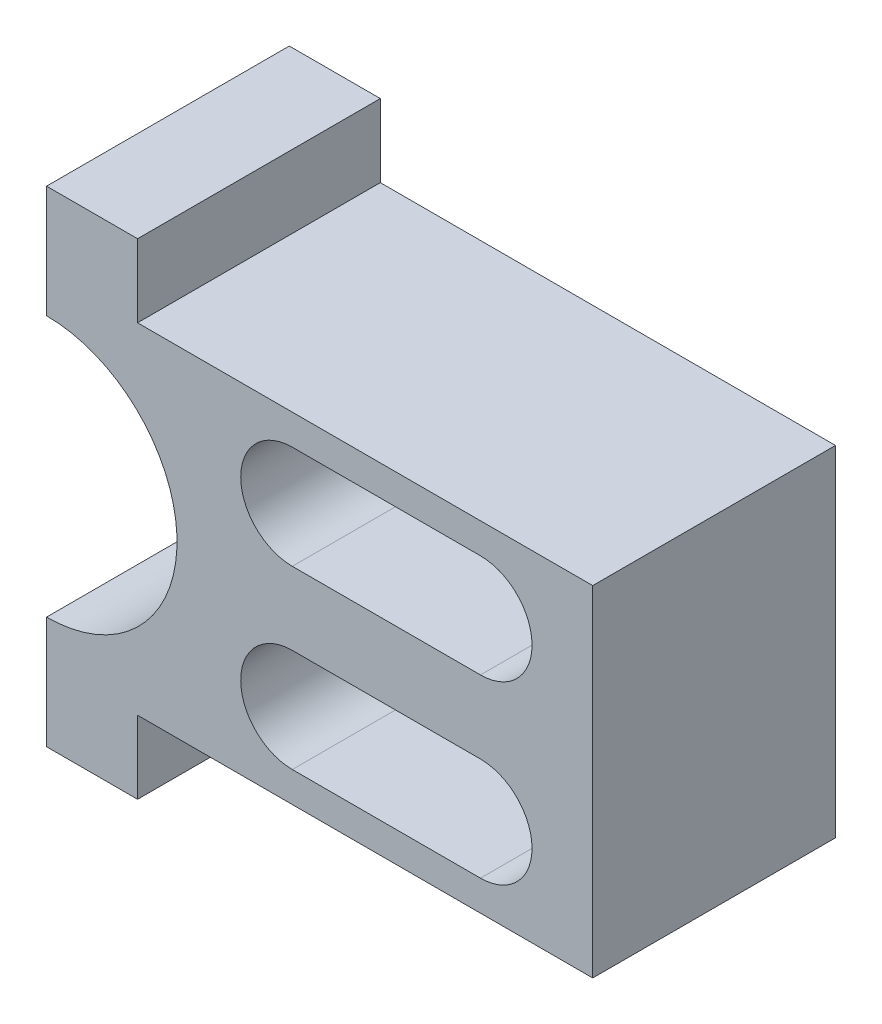
ISO-10303-21;
HEADER;
FILE_DESCRIPTION(('STEP AP214'),'2;1');
FILE_NAME('part.step','',(''),(''),'','','');
FILE_SCHEMA(('AUTOMOTIVE_DESIGN { 1 0 10303 214 1 1 1 1 }'));
ENDSEC;
DATA;
#1=APPLICATION_CONTEXT('core data for automotive mechanical design processes');
#2=APPLICATION_PROTOCOL_DEFINITION('international standard','automotive_design',2000,#1);
#3=PRODUCT_CONTEXT('',#1,'mechanical');
#4=PRODUCT('Part','Part','',(#3));
#5=PRODUCT_RELATED_PRODUCT_CATEGORY('part','',(#4));
#6=PRODUCT_DEFINITION_FORMATION('','',#4);
#7=PRODUCT_DEFINITION_CONTEXT('part definition',#1,'design');
#8=PRODUCT_DEFINITION('design','',#6,#7);
#9=PRODUCT_DEFINITION_SHAPE('','',#8);
#10=(LENGTH_UNIT() NAMED_UNIT(*) SI_UNIT(.MILLI.,.METRE.));
#11=(NAMED_UNIT(*) PLANE_ANGLE_UNIT() SI_UNIT($,.RADIAN.));
#12=(NAMED_UNIT(*) SI_UNIT($,.STERADIAN.) SOLID_ANGLE_UNIT());
#13=UNCERTAINTY_MEASURE_WITH_UNIT(LENGTH_MEASURE(1.E-05),#10,'distance_accuracy_value','');
#14=(GEOMETRIC_REPRESENTATION_CONTEXT(3) GLOBAL_UNCERTAINTY_ASSIGNED_CONTEXT((#13)) GLOBAL_UNIT_ASSIGNED_CONTEXT((#10,
#11,#12)) REPRESENTATION_CONTEXT('',''));
#15=CARTESIAN_POINT('',(0.,0.,0.));
#16=DIRECTION('',(0.,0.,1.));
#17=DIRECTION('',(1.,0.,0.));
#18=AXIS2_PLACEMENT_3D('',#15,#16,#17);
#19=CARTESIAN_POINT('',(0.,-40.,40.));
#20=DIRECTION('',(0.,-1.,0.));
#21=DIRECTION('',(1.,0.,0.));
#22=AXIS2_PLACEMENT_3D('',#19,#20,#21);
#23=PLANE('',#22);
#24=DIRECTION('',(-1.,0.,0.));
#25=VECTOR('',#24,1.);
#26=CARTESIAN_POINT('',(0.,-40.,0.));
#27=LINE('',#26,#25);
#28=CARTESIAN_POINT('',(-30.,-40.,0.));
#29=VERTEX_POINT('',#28);
#30=CARTESIAN_POINT('',(-45.,-40.,0.));
#31=VERTEX_POINT('',#30);
#32=EDGE_CURVE('E191',#29,#31,#27,.T.);
#33=ORIENTED_EDGE('',*,*,#32,.F.);
#34=DIRECTION('',(0.,0.,1.));
#35=VECTOR('',#34,1.);
#36=CARTESIAN_POINT('',(-30.,-40.,0.));
#37=LINE('',#36,#35);
#38=CARTESIAN_POINT('',(-30.,-40.,40.));
#39=VERTEX_POINT('',#38);
#40=EDGE_CURVE('E397',#29,#39,#37,.T.);
#41=ORIENTED_EDGE('',*,*,#40,.T.);
#42=DIRECTION('',(-1.,0.,0.));
#43=VECTOR('',#42,1.);
#44=CARTESIAN_POINT('',(0.,-40.,40.));
#45=LINE('',#44,#43);
#46=CARTESIAN_POINT('',(-45.,-40.,40.));
#47=VERTEX_POINT('',#46);
#48=EDGE_CURVE('E289',#39,#47,#45,.T.);
#49=ORIENTED_EDGE('',*,*,#48,.T.);
#50=DIRECTION('',(0.,0.,-1.));
#51=VECTOR('',#50,1.);
#52=CARTESIAN_POINT('',(-45.,-40.,40.));
#53=LINE('',#52,#51);
#54=EDGE_CURVE('E223',#47,#31,#53,.T.);
#55=ORIENTED_EDGE('',*,*,#54,.T.);
#56=EDGE_LOOP('',(#33,#41,#49,#55));
#57=FACE_BOUND('',#56,.T.);
#58=ADVANCED_FACE('F43',(#57),#23,.T.);
#59=CARTESIAN_POINT('',(45.,0.,40.));
#60=DIRECTION('',(1.,0.,0.));
#61=DIRECTION('',(0.,1.,0.));
#62=AXIS2_PLACEMENT_3D('',#59,#60,#61);
#63=PLANE('',#62);
#64=DIRECTION('',(0.,-1.,0.));
#65=VECTOR('',#64,1.);
#66=CARTESIAN_POINT('',(45.,0.,40.));
#67=LINE('',#66,#65);
#68=CARTESIAN_POINT('',(45.,28.,40.));
#69=VERTEX_POINT('',#68);
#70=CARTESIAN_POINT('',(45.,-28.,40.));
#71=VERTEX_POINT('',#70);
#72=EDGE_CURVE('E186',#69,#71,#67,.T.);
#73=ORIENTED_EDGE('',*,*,#72,.T.);
#74=DIRECTION('',(0.,0.,1.));
#75=VECTOR('',#74,1.);
#76=CARTESIAN_POINT('',(45.,-28.,0.));
#77=LINE('',#76,#75);
#78=CARTESIAN_POINT('',(45.,-28.,0.));
#79=VERTEX_POINT('',#78);
#80=EDGE_CURVE('E171',#79,#71,#77,.T.);
#81=ORIENTED_EDGE('',*,*,#80,.F.);
#82=DIRECTION('',(0.,-1.,0.));
#83=VECTOR('',#82,1.);
#84=CARTESIAN_POINT('',(45.,0.,0.));
#85=LINE('',#84,#83);
#86=CARTESIAN_POINT('',(45.,28.,0.));
#87=VERTEX_POINT('',#86);
#88=EDGE_CURVE('E184',#87,#79,#85,.T.);
#89=ORIENTED_EDGE('',*,*,#88,.F.);
#90=DIRECTION('',(0.,0.,1.));
#91=VECTOR('',#90,1.);
#92=CARTESIAN_POINT('',(45.,28.,0.));
#93=LINE('',#92,#91);
#94=EDGE_CURVE('E254',#87,#69,#93,.T.);
#95=ORIENTED_EDGE('',*,*,#94,.T.);
#96=EDGE_LOOP('',(#73,#81,#89,#95));
#97=FACE_BOUND('',#96,.T.);
#98=ADVANCED_FACE('F182',(#97),#63,.T.);
#99=CARTESIAN_POINT('',(0.,0.,40.));
#100=DIRECTION('',(0.,0.,1.));
#101=DIRECTION('',(1.,0.,0.));
#102=AXIS2_PLACEMENT_3D('',#99,#100,#101);
#103=PLANE('',#102);
#104=CARTESIAN_POINT('',(26.5,-14.5,40.));
#105=DIRECTION('',(0.,0.,1.));
#106=DIRECTION('',(1.,0.,0.));
#107=AXIS2_PLACEMENT_3D('',#104,#105,#106);
#108=CIRCLE('',#107,8.5);
#109=CARTESIAN_POINT('',(26.5,-23.,40.));
#110=VERTEX_POINT('',#109);
#111=CARTESIAN_POINT('',(26.5,-6.,40.));
#112=VERTEX_POINT('',#111);
#113=EDGE_CURVE('E210',#110,#112,#108,.T.);
#114=ORIENTED_EDGE('',*,*,#113,.F.);
#115=DIRECTION('',(1.,0.,0.));
#116=VECTOR('',#115,1.);
#117=CARTESIAN_POINT('',(0.,-23.,40.));
#118=LINE('',#117,#116);
#119=CARTESIAN_POINT('',(-4.5,-23.,40.));
#120=VERTEX_POINT('',#119);
#121=EDGE_CURVE('E244',#120,#110,#118,.T.);
#122=ORIENTED_EDGE('',*,*,#121,.F.);
#123=CARTESIAN_POINT('',(-4.5,-14.5,40.));
#124=DIRECTION('',(0.,0.,1.));
#125=DIRECTION('',(1.,0.,0.));
#126=AXIS2_PLACEMENT_3D('',#123,#124,#125);
#127=CIRCLE('',#126,8.5);
#128=CARTESIAN_POINT('',(-4.5,-6.,40.));
#129=VERTEX_POINT('',#128);
#130=EDGE_CURVE('E292',#129,#120,#127,.T.);
#131=ORIENTED_EDGE('',*,*,#130,.F.);
#132=DIRECTION('',(1.,0.,0.));
#133=VECTOR('',#132,1.);
#134=CARTESIAN_POINT('',(0.,-6.,40.));
#135=LINE('',#134,#133);
#136=EDGE_CURVE('E287',#129,#112,#135,.T.);
#137=ORIENTED_EDGE('',*,*,#136,.T.);
#138=EDGE_LOOP('',(#114,#122,#131,#137));
#139=FACE_BOUND('',#138,.T.);
#140=DIRECTION('',(1.,0.,0.));
#141=VECTOR('',#140,1.);
#142=CARTESIAN_POINT('',(0.,23.,40.));
#143=LINE('',#142,#141);
#144=CARTESIAN_POINT('',(-4.5,23.,40.));
#145=VERTEX_POINT('',#144);
#146=CARTESIAN_POINT('',(26.5,23.,40.));
#147=VERTEX_POINT('',#146);
#148=EDGE_CURVE('E300',#145,#147,#143,.T.);
#149=ORIENTED_EDGE('',*,*,#148,.T.);
#150=CARTESIAN_POINT('',(26.5,14.5,40.));
#151=DIRECTION('',(0.,0.,1.));
#152=DIRECTION('',(1.,0.,0.));
#153=AXIS2_PLACEMENT_3D('',#150,#151,#152);
#154=CIRCLE('',#153,8.5);
#155=CARTESIAN_POINT('',(26.5,6.,40.));
#156=VERTEX_POINT('',#155);
#157=EDGE_CURVE('E303',#147,#156,#154,.F.);
#158=ORIENTED_EDGE('',*,*,#157,.T.);
#159=DIRECTION('',(1.,0.,0.));
#160=VECTOR('',#159,1.);
#161=CARTESIAN_POINT('',(0.,6.,40.));
#162=LINE('',#161,#160);
#163=CARTESIAN_POINT('',(-4.5,6.,40.));
#164=VERTEX_POINT('',#163);
#165=EDGE_CURVE('E305',#164,#156,#162,.T.);
#166=ORIENTED_EDGE('',*,*,#165,.F.);
#167=CARTESIAN_POINT('',(-4.5,14.5,40.));
#168=DIRECTION('',(0.,0.,1.));
#169=DIRECTION('',(1.,0.,0.));
#170=AXIS2_PLACEMENT_3D('',#167,#168,#169);
#171=CIRCLE('',#170,8.5);
#172=EDGE_CURVE('E230',#164,#145,#171,.F.);
#173=ORIENTED_EDGE('',*,*,#172,.T.);
#174=EDGE_LOOP('',(#149,#158,#166,#173));
#175=FACE_BOUND('',#174,.T.);
#176=ORIENTED_EDGE('',*,*,#48,.F.);
#177=DIRECTION('',(0.,1.,0.));
#178=VECTOR('',#177,1.);
#179=CARTESIAN_POINT('',(-30.,-40.,40.));
#180=LINE('',#179,#178);
#181=CARTESIAN_POINT('',(-30.,-28.,40.));
#182=VERTEX_POINT('',#181);
#183=EDGE_CURVE('E177',#39,#182,#180,.T.);
#184=ORIENTED_EDGE('',*,*,#183,.T.);
#185=DIRECTION('',(1.,0.,0.));
#186=VECTOR('',#185,1.);
#187=CARTESIAN_POINT('',(45.,-28.,40.));
#188=LINE('',#187,#186);
#189=EDGE_CURVE('E399',#182,#71,#188,.T.);
#190=ORIENTED_EDGE('',*,*,#189,.T.);
#191=ORIENTED_EDGE('',*,*,#72,.F.);
#192=DIRECTION('',(1.,0.,0.));
#193=VECTOR('',#192,1.);
#194=CARTESIAN_POINT('',(45.,28.,40.));
#195=LINE('',#194,#193);
#196=CARTESIAN_POINT('',(-30.,28.,40.));
#197=VERTEX_POINT('',#196);
#198=EDGE_CURVE('E404',#197,#69,#195,.T.);
#199=ORIENTED_EDGE('',*,*,#198,.F.);
#200=DIRECTION('',(0.,-1.,0.));
#201=VECTOR('',#200,1.);
#202=CARTESIAN_POINT('',(-30.,40.,40.));
#203=LINE('',#202,#201);
#204=CARTESIAN_POINT('',(-30.,40.,40.));
#205=VERTEX_POINT('',#204);
#206=EDGE_CURVE('E401',#205,#197,#203,.T.);
#207=ORIENTED_EDGE('',*,*,#206,.F.);
#208=DIRECTION('',(-1.,0.,0.));
#209=VECTOR('',#208,1.);
#210=CARTESIAN_POINT('',(0.,40.,40.));
#211=LINE('',#210,#209);
#212=CARTESIAN_POINT('',(-45.,40.,40.));
#213=VERTEX_POINT('',#212);
#214=EDGE_CURVE('E298',#205,#213,#211,.T.);
#215=ORIENTED_EDGE('',*,*,#214,.T.);
#216=DIRECTION('',(0.,-1.,0.));
#217=VECTOR('',#216,1.);
#218=CARTESIAN_POINT('',(-45.,0.,40.));
#219=LINE('',#218,#217);
#220=CARTESIAN_POINT('',(-45.,21.5,40.));
#221=VERTEX_POINT('',#220);
#222=EDGE_CURVE('E291',#213,#221,#219,.T.);
#223=ORIENTED_EDGE('',*,*,#222,.T.);
#224=CARTESIAN_POINT('',(-45.,0.,40.));
#225=DIRECTION('',(0.,0.,1.));
#226=DIRECTION('',(1.,0.,0.));
#227=AXIS2_PLACEMENT_3D('',#224,#225,#226);
#228=CIRCLE('',#227,21.5);
#229=CARTESIAN_POINT('',(-45.,-21.5,40.));
#230=VERTEX_POINT('',#229);
#231=EDGE_CURVE('E283',#230,#221,#228,.T.);
#232=ORIENTED_EDGE('',*,*,#231,.F.);
#233=EDGE_CURVE('E286',#230,#47,#219,.T.);
#234=ORIENTED_EDGE('',*,*,#233,.T.);
#235=EDGE_LOOP('',(#176,#184,#190,#191,#199,#207,#215,#223,#232,#234));
#236=FACE_BOUND('',#235,.T.);
#237=ADVANCED_FACE('F311',(#139,#175,#236),#103,.T.);
#238=CARTESIAN_POINT('',(0.,0.,0.));
#239=DIRECTION('',(0.,0.,1.));
#240=DIRECTION('',(1.,0.,0.));
#241=AXIS2_PLACEMENT_3D('',#238,#239,#240);
#242=PLANE('',#241);
#243=DIRECTION('',(1.,0.,0.));
#244=VECTOR('',#243,1.);
#245=CARTESIAN_POINT('',(0.,23.,0.));
#246=LINE('',#245,#244);
#247=CARTESIAN_POINT('',(-4.5,23.,0.));
#248=VERTEX_POINT('',#247);
#249=CARTESIAN_POINT('',(26.5,23.,0.));
#250=VERTEX_POINT('',#249);
#251=EDGE_CURVE('E199',#248,#250,#246,.T.);
#252=ORIENTED_EDGE('',*,*,#251,.F.);
#253=CARTESIAN_POINT('',(-4.5,14.5,0.));
#254=DIRECTION('',(0.,0.,1.));
#255=DIRECTION('',(1.,0.,0.));
#256=AXIS2_PLACEMENT_3D('',#253,#254,#255);
#257=CIRCLE('',#256,8.5);
#258=CARTESIAN_POINT('',(-4.5,6.,0.));
#259=VERTEX_POINT('',#258);
#260=EDGE_CURVE('E208',#259,#248,#257,.F.);
#261=ORIENTED_EDGE('',*,*,#260,.F.);
#262=DIRECTION('',(1.,0.,0.));
#263=VECTOR('',#262,1.);
#264=CARTESIAN_POINT('',(0.,6.,0.));
#265=LINE('',#264,#263);
#266=CARTESIAN_POINT('',(26.5,6.,0.));
#267=VERTEX_POINT('',#266);
#268=EDGE_CURVE('E205',#259,#267,#265,.T.);
#269=ORIENTED_EDGE('',*,*,#268,.T.);
#270=CARTESIAN_POINT('',(26.5,14.5,0.));
#271=DIRECTION('',(0.,0.,1.));
#272=DIRECTION('',(1.,0.,0.));
#273=AXIS2_PLACEMENT_3D('',#270,#271,#272);
#274=CIRCLE('',#273,8.5);
#275=EDGE_CURVE('E202',#250,#267,#274,.F.);
#276=ORIENTED_EDGE('',*,*,#275,.F.);
#277=EDGE_LOOP('',(#252,#261,#269,#276));
#278=FACE_BOUND('',#277,.T.);
#279=CARTESIAN_POINT('',(26.5,-14.5,0.));
#280=DIRECTION('',(0.,0.,1.));
#281=DIRECTION('',(1.,0.,0.));
#282=AXIS2_PLACEMENT_3D('',#279,#280,#281);
#283=CIRCLE('',#282,8.5);
#284=CARTESIAN_POINT('',(26.5,-23.,0.));
#285=VERTEX_POINT('',#284);
#286=CARTESIAN_POINT('',(26.5,-6.,0.));
#287=VERTEX_POINT('',#286);
#288=EDGE_CURVE('E249',#285,#287,#283,.T.);
#289=ORIENTED_EDGE('',*,*,#288,.T.);
#290=DIRECTION('',(1.,0.,0.));
#291=VECTOR('',#290,1.);
#292=CARTESIAN_POINT('',(0.,-6.,0.));
#293=LINE('',#292,#291);
#294=CARTESIAN_POINT('',(-4.5,-6.,0.));
#295=VERTEX_POINT('',#294);
#296=EDGE_CURVE('E258',#295,#287,#293,.T.);
#297=ORIENTED_EDGE('',*,*,#296,.F.);
#298=CARTESIAN_POINT('',(-4.5,-14.5,0.));
#299=DIRECTION('',(0.,0.,1.));
#300=DIRECTION('',(1.,0.,0.));
#301=AXIS2_PLACEMENT_3D('',#298,#299,#300);
#302=CIRCLE('',#301,8.5);
#303=CARTESIAN_POINT('',(-4.5,-23.,0.));
#304=VERTEX_POINT('',#303);
#305=EDGE_CURVE('E256',#295,#304,#302,.T.);
#306=ORIENTED_EDGE('',*,*,#305,.T.);
#307=DIRECTION('',(1.,0.,0.));
#308=VECTOR('',#307,1.);
#309=CARTESIAN_POINT('',(0.,-23.,0.));
#310=LINE('',#309,#308);
#311=EDGE_CURVE('E241',#304,#285,#310,.T.);
#312=ORIENTED_EDGE('',*,*,#311,.T.);
#313=EDGE_LOOP('',(#289,#297,#306,#312));
#314=FACE_BOUND('',#313,.T.);
#315=DIRECTION('',(0.,1.,0.));
#316=VECTOR('',#315,1.);
#317=CARTESIAN_POINT('',(-30.,-40.,0.));
#318=LINE('',#317,#316);
#319=CARTESIAN_POINT('',(-30.,-28.,0.));
#320=VERTEX_POINT('',#319);
#321=EDGE_CURVE('E176',#29,#320,#318,.T.);
#322=ORIENTED_EDGE('',*,*,#321,.F.);
#323=ORIENTED_EDGE('',*,*,#32,.T.);
#324=DIRECTION('',(0.,-1.,0.));
#325=VECTOR('',#324,1.);
#326=CARTESIAN_POINT('',(-45.,0.,0.));
#327=LINE('',#326,#325);
#328=CARTESIAN_POINT('',(-45.,-21.5,0.));
#329=VERTEX_POINT('',#328);
#330=EDGE_CURVE('E195',#329,#31,#327,.T.);
#331=ORIENTED_EDGE('',*,*,#330,.F.);
#332=CARTESIAN_POINT('',(-45.,0.,0.));
#333=DIRECTION('',(0.,0.,1.));
#334=DIRECTION('',(1.,0.,0.));
#335=AXIS2_PLACEMENT_3D('',#332,#333,#334);
#336=CIRCLE('',#335,21.5);
#337=CARTESIAN_POINT('',(-45.,21.5,0.));
#338=VERTEX_POINT('',#337);
#339=EDGE_CURVE('E263',#329,#338,#336,.T.);
#340=ORIENTED_EDGE('',*,*,#339,.T.);
#341=CARTESIAN_POINT('',(-45.,40.,0.));
#342=VERTEX_POINT('',#341);
#343=EDGE_CURVE('E193',#342,#338,#327,.T.);
#344=ORIENTED_EDGE('',*,*,#343,.F.);
#345=DIRECTION('',(-1.,0.,0.));
#346=VECTOR('',#345,1.);
#347=CARTESIAN_POINT('',(0.,40.,0.));
#348=LINE('',#347,#346);
#349=CARTESIAN_POINT('',(-30.,40.,0.));
#350=VERTEX_POINT('',#349);
#351=EDGE_CURVE('E190',#350,#342,#348,.T.);
#352=ORIENTED_EDGE('',*,*,#351,.F.);
#353=DIRECTION('',(0.,-1.,0.));
#354=VECTOR('',#353,1.);
#355=CARTESIAN_POINT('',(-30.,40.,0.));
#356=LINE('',#355,#354);
#357=CARTESIAN_POINT('',(-30.,28.,0.));
#358=VERTEX_POINT('',#357);
#359=EDGE_CURVE('E409',#350,#358,#356,.T.);
#360=ORIENTED_EDGE('',*,*,#359,.T.);
#361=DIRECTION('',(1.,0.,0.));
#362=VECTOR('',#361,1.);
#363=CARTESIAN_POINT('',(45.,28.,0.));
#364=LINE('',#363,#362);
#365=EDGE_CURVE('E68',#358,#87,#364,.T.);
#366=ORIENTED_EDGE('',*,*,#365,.T.);
#367=ORIENTED_EDGE('',*,*,#88,.T.);
#368=DIRECTION('',(1.,0.,0.));
#369=VECTOR('',#368,1.);
#370=CARTESIAN_POINT('',(45.,-28.,0.));
#371=LINE('',#370,#369);
#372=EDGE_CURVE('E168',#320,#79,#371,.T.);
#373=ORIENTED_EDGE('',*,*,#372,.F.);
#374=EDGE_LOOP('',(#322,#323,#331,#340,#344,#352,#360,#366,#367,#373));
#375=FACE_BOUND('',#374,.T.);
#376=ADVANCED_FACE('F188',(#278,#314,#375),#242,.F.);
#377=CARTESIAN_POINT('',(0.,23.,40.));
#378=DIRECTION('',(0.,1.,0.));
#379=DIRECTION('',(0.,0.,1.));
#380=AXIS2_PLACEMENT_3D('',#377,#378,#379);
#381=PLANE('',#380);
#382=ORIENTED_EDGE('',*,*,#251,.T.);
#383=DIRECTION('',(0.,0.,-1.));
#384=VECTOR('',#383,1.);
#385=CARTESIAN_POINT('',(26.5,23.,40.));
#386=LINE('',#385,#384);
#387=EDGE_CURVE('E11',#147,#250,#386,.T.);
#388=ORIENTED_EDGE('',*,*,#387,.F.);
#389=ORIENTED_EDGE('',*,*,#148,.F.);
#390=DIRECTION('',(0.,0.,-1.));
#391=VECTOR('',#390,1.);
#392=CARTESIAN_POINT('',(-4.5,23.,40.));
#393=LINE('',#392,#391);
#394=EDGE_CURVE('E211',#145,#248,#393,.T.);
#395=ORIENTED_EDGE('',*,*,#394,.T.);
#396=EDGE_LOOP('',(#382,#388,#389,#395));
#397=FACE_BOUND('',#396,.T.);
#398=ADVANCED_FACE('F319',(#397),#381,.F.);
#399=CARTESIAN_POINT('',(26.5,14.5,40.));
#400=DIRECTION('',(0.,0.,-1.));
#401=DIRECTION('',(-1.,0.,0.));
#402=AXIS2_PLACEMENT_3D('',#399,#400,#401);
#403=CYLINDRICAL_SURFACE('',#402,8.5);
#404=ORIENTED_EDGE('',*,*,#275,.T.);
#405=DIRECTION('',(0.,0.,-1.));
#406=VECTOR('',#405,1.);
#407=CARTESIAN_POINT('',(26.5,6.,40.));
#408=LINE('',#407,#406);
#409=EDGE_CURVE('E52',#156,#267,#408,.T.);
#410=ORIENTED_EDGE('',*,*,#409,.F.);
#411=ORIENTED_EDGE('',*,*,#157,.F.);
#412=ORIENTED_EDGE('',*,*,#387,.T.);
#413=EDGE_LOOP('',(#404,#410,#411,#412));
#414=FACE_BOUND('',#413,.T.);
#415=ADVANCED_FACE('F321',(#414),#403,.F.);
#416=CARTESIAN_POINT('',(0.,6.,40.));
#417=DIRECTION('',(0.,1.,0.));
#418=DIRECTION('',(-1.,0.,0.));
#419=AXIS2_PLACEMENT_3D('',#416,#417,#418);
#420=PLANE('',#419);
#421=ORIENTED_EDGE('',*,*,#268,.F.);
#422=DIRECTION('',(0.,0.,-1.));
#423=VECTOR('',#422,1.);
#424=CARTESIAN_POINT('',(-4.5,6.,40.));
#425=LINE('',#424,#423);
#426=EDGE_CURVE('E214',#164,#259,#425,.T.);
#427=ORIENTED_EDGE('',*,*,#426,.F.);
#428=ORIENTED_EDGE('',*,*,#165,.T.);
#429=ORIENTED_EDGE('',*,*,#409,.T.);
#430=EDGE_LOOP('',(#421,#427,#428,#429));
#431=FACE_BOUND('',#430,.T.);
#432=ADVANCED_FACE('F325',(#431),#420,.T.);
#433=CARTESIAN_POINT('',(-45.,0.,40.));
#434=DIRECTION('',(0.,0.,-1.));
#435=DIRECTION('',(-1.,0.,0.));
#436=AXIS2_PLACEMENT_3D('',#433,#434,#435);
#437=CYLINDRICAL_SURFACE('',#436,21.5);
#438=ORIENTED_EDGE('',*,*,#339,.F.);
#439=DIRECTION('',(0.,0.,-1.));
#440=VECTOR('',#439,1.);
#441=CARTESIAN_POINT('',(-45.,-21.5,40.));
#442=LINE('',#441,#440);
#443=EDGE_CURVE('E215',#230,#329,#442,.T.);
#444=ORIENTED_EDGE('',*,*,#443,.F.);
#445=ORIENTED_EDGE('',*,*,#231,.T.);
#446=DIRECTION('',(0.,0.,-1.));
#447=VECTOR('',#446,1.);
#448=CARTESIAN_POINT('',(-45.,21.5,40.));
#449=LINE('',#448,#447);
#450=EDGE_CURVE('E218',#221,#338,#449,.T.);
#451=ORIENTED_EDGE('',*,*,#450,.T.);
#452=EDGE_LOOP('',(#438,#444,#445,#451));
#453=FACE_BOUND('',#452,.T.);
#454=ADVANCED_FACE('F280',(#453),#437,.F.);
#455=CARTESIAN_POINT('',(-45.,0.,40.));
#456=DIRECTION('',(1.,0.,0.));
#457=DIRECTION('',(0.,1.,0.));
#458=AXIS2_PLACEMENT_3D('',#455,#456,#457);
#459=PLANE('',#458);
#460=ORIENTED_EDGE('',*,*,#330,.T.);
#461=ORIENTED_EDGE('',*,*,#54,.F.);
#462=ORIENTED_EDGE('',*,*,#233,.F.);
#463=ORIENTED_EDGE('',*,*,#443,.T.);
#464=EDGE_LOOP('',(#460,#461,#462,#463));
#465=FACE_BOUND('',#464,.T.);
#466=ADVANCED_FACE('F351',(#465),#459,.F.);
#467=CARTESIAN_POINT('',(0.,40.,40.));
#468=DIRECTION('',(0.,-1.,0.));
#469=DIRECTION('',(1.,0.,0.));
#470=AXIS2_PLACEMENT_3D('',#467,#468,#469);
#471=PLANE('',#470);
#472=ORIENTED_EDGE('',*,*,#214,.F.);
#473=DIRECTION('',(0.,0.,1.));
#474=VECTOR('',#473,1.);
#475=CARTESIAN_POINT('',(-30.,40.,0.));
#476=LINE('',#475,#474);
#477=EDGE_CURVE('E411',#350,#205,#476,.T.);
#478=ORIENTED_EDGE('',*,*,#477,.F.);
#479=ORIENTED_EDGE('',*,*,#351,.T.);
#480=DIRECTION('',(0.,0.,-1.));
#481=VECTOR('',#480,1.);
#482=CARTESIAN_POINT('',(-45.,40.,40.));
#483=LINE('',#482,#481);
#484=EDGE_CURVE('E220',#213,#342,#483,.T.);
#485=ORIENTED_EDGE('',*,*,#484,.F.);
#486=EDGE_LOOP('',(#472,#478,#479,#485));
#487=FACE_BOUND('',#486,.T.);
#488=ADVANCED_FACE('F362',(#487),#471,.F.);
#489=CARTESIAN_POINT('',(26.5,-14.5,40.));
#490=DIRECTION('',(0.,0.,-1.));
#491=DIRECTION('',(-1.,0.,0.));
#492=AXIS2_PLACEMENT_3D('',#489,#490,#491);
#493=CYLINDRICAL_SURFACE('',#492,8.5);
#494=ORIENTED_EDGE('',*,*,#288,.F.);
#495=DIRECTION('',(0.,0.,-1.));
#496=VECTOR('',#495,1.);
#497=CARTESIAN_POINT('',(26.5,-23.,40.));
#498=LINE('',#497,#496);
#499=EDGE_CURVE('E47',#110,#285,#498,.T.);
#500=ORIENTED_EDGE('',*,*,#499,.F.);
#501=ORIENTED_EDGE('',*,*,#113,.T.);
#502=DIRECTION('',(0.,0.,-1.));
#503=VECTOR('',#502,1.);
#504=CARTESIAN_POINT('',(26.5,-6.,40.));
#505=LINE('',#504,#503);
#506=EDGE_CURVE('E227',#112,#287,#505,.T.);
#507=ORIENTED_EDGE('',*,*,#506,.T.);
#508=EDGE_LOOP('',(#494,#500,#501,#507));
#509=FACE_BOUND('',#508,.T.);
#510=ADVANCED_FACE('F45',(#509),#493,.F.);
#511=CARTESIAN_POINT('',(0.,-23.,40.));
#512=DIRECTION('',(0.,1.,0.));
#513=DIRECTION('',(0.,0.,1.));
#514=AXIS2_PLACEMENT_3D('',#511,#512,#513);
#515=PLANE('',#514);
#516=ORIENTED_EDGE('',*,*,#311,.F.);
#517=DIRECTION('',(0.,0.,-1.));
#518=VECTOR('',#517,1.);
#519=CARTESIAN_POINT('',(-4.5,-23.,40.));
#520=LINE('',#519,#518);
#521=EDGE_CURVE('E231',#120,#304,#520,.T.);
#522=ORIENTED_EDGE('',*,*,#521,.F.);
#523=ORIENTED_EDGE('',*,*,#121,.T.);
#524=ORIENTED_EDGE('',*,*,#499,.T.);
#525=EDGE_LOOP('',(#516,#522,#523,#524));
#526=FACE_BOUND('',#525,.T.);
#527=ADVANCED_FACE('F239',(#526),#515,.T.);
#528=CARTESIAN_POINT('',(-4.5,-14.5,40.));
#529=DIRECTION('',(0.,0.,-1.));
#530=DIRECTION('',(-1.,0.,0.));
#531=AXIS2_PLACEMENT_3D('',#528,#529,#530);
#532=CYLINDRICAL_SURFACE('',#531,8.5);
#533=ORIENTED_EDGE('',*,*,#305,.F.);
#534=DIRECTION('',(0.,0.,-1.));
#535=VECTOR('',#534,1.);
#536=CARTESIAN_POINT('',(-4.5,-6.,40.));
#537=LINE('',#536,#535);
#538=EDGE_CURVE('E229',#129,#295,#537,.T.);
#539=ORIENTED_EDGE('',*,*,#538,.F.);
#540=ORIENTED_EDGE('',*,*,#130,.T.);
#541=ORIENTED_EDGE('',*,*,#521,.T.);
#542=EDGE_LOOP('',(#533,#539,#540,#541));
#543=FACE_BOUND('',#542,.T.);
#544=ADVANCED_FACE('F356',(#543),#532,.F.);
#545=ORIENTED_EDGE('',*,*,#343,.T.);
#546=ORIENTED_EDGE('',*,*,#450,.F.);
#547=ORIENTED_EDGE('',*,*,#222,.F.);
#548=ORIENTED_EDGE('',*,*,#484,.T.);
#549=EDGE_LOOP('',(#545,#546,#547,#548));
#550=FACE_BOUND('',#549,.T.);
#551=ADVANCED_FACE('F273',(#550),#459,.F.);
#552=CARTESIAN_POINT('',(0.,-6.,40.));
#553=DIRECTION('',(0.,1.,0.));
#554=DIRECTION('',(0.,0.,1.));
#555=AXIS2_PLACEMENT_3D('',#552,#553,#554);
#556=PLANE('',#555);
#557=ORIENTED_EDGE('',*,*,#296,.T.);
#558=ORIENTED_EDGE('',*,*,#506,.F.);
#559=ORIENTED_EDGE('',*,*,#136,.F.);
#560=ORIENTED_EDGE('',*,*,#538,.T.);
#561=EDGE_LOOP('',(#557,#558,#559,#560));
#562=FACE_BOUND('',#561,.T.);
#563=ADVANCED_FACE('F352',(#562),#556,.F.);
#564=CARTESIAN_POINT('',(-4.5,14.5,40.));
#565=DIRECTION('',(0.,0.,-1.));
#566=DIRECTION('',(-1.,0.,0.));
#567=AXIS2_PLACEMENT_3D('',#564,#565,#566);
#568=CYLINDRICAL_SURFACE('',#567,8.5);
#569=ORIENTED_EDGE('',*,*,#260,.T.);
#570=ORIENTED_EDGE('',*,*,#394,.F.);
#571=ORIENTED_EDGE('',*,*,#172,.F.);
#572=ORIENTED_EDGE('',*,*,#426,.T.);
#573=EDGE_LOOP('',(#569,#570,#571,#572));
#574=FACE_BOUND('',#573,.T.);
#575=ADVANCED_FACE('F315',(#574),#568,.F.);
#576=CARTESIAN_POINT('',(45.,28.,0.));
#577=DIRECTION('',(0.,-1.,0.));
#578=DIRECTION('',(1.,0.,0.));
#579=AXIS2_PLACEMENT_3D('',#576,#577,#578);
#580=PLANE('',#579);
#581=ORIENTED_EDGE('',*,*,#198,.T.);
#582=ORIENTED_EDGE('',*,*,#94,.F.);
#583=ORIENTED_EDGE('',*,*,#365,.F.);
#584=DIRECTION('',(0.,0.,1.));
#585=VECTOR('',#584,1.);
#586=CARTESIAN_POINT('',(-30.,28.,0.));
#587=LINE('',#586,#585);
#588=EDGE_CURVE('E415',#358,#197,#587,.T.);
#589=ORIENTED_EDGE('',*,*,#588,.T.);
#590=EDGE_LOOP('',(#581,#582,#583,#589));
#591=FACE_BOUND('',#590,.T.);
#592=ADVANCED_FACE('F379',(#591),#580,.F.);
#593=CARTESIAN_POINT('',(-30.,40.,0.));
#594=DIRECTION('',(-1.,0.,0.));
#595=DIRECTION('',(0.,0.,1.));
#596=AXIS2_PLACEMENT_3D('',#593,#594,#595);
#597=PLANE('',#596);
#598=ORIENTED_EDGE('',*,*,#206,.T.);
#599=ORIENTED_EDGE('',*,*,#588,.F.);
#600=ORIENTED_EDGE('',*,*,#359,.F.);
#601=ORIENTED_EDGE('',*,*,#477,.T.);
#602=EDGE_LOOP('',(#598,#599,#600,#601));
#603=FACE_BOUND('',#602,.T.);
#604=ADVANCED_FACE('F382',(#603),#597,.F.);
#605=CARTESIAN_POINT('',(-30.,-40.,0.));
#606=DIRECTION('',(1.,0.,0.));
#607=DIRECTION('',(0.,0.,-1.));
#608=AXIS2_PLACEMENT_3D('',#605,#606,#607);
#609=PLANE('',#608);
#610=ORIENTED_EDGE('',*,*,#183,.F.);
#611=ORIENTED_EDGE('',*,*,#40,.F.);
#612=ORIENTED_EDGE('',*,*,#321,.T.);
#613=DIRECTION('',(0.,0.,1.));
#614=VECTOR('',#613,1.);
#615=CARTESIAN_POINT('',(-30.,-28.,0.));
#616=LINE('',#615,#614);
#617=EDGE_CURVE('E60',#320,#182,#616,.T.);
#618=ORIENTED_EDGE('',*,*,#617,.T.);
#619=EDGE_LOOP('',(#610,#611,#612,#618));
#620=FACE_BOUND('',#619,.T.);
#621=ADVANCED_FACE('F386',(#620),#609,.T.);
#622=CARTESIAN_POINT('',(45.,-28.,0.));
#623=DIRECTION('',(0.,-1.,0.));
#624=DIRECTION('',(1.,0.,0.));
#625=AXIS2_PLACEMENT_3D('',#622,#623,#624);
#626=PLANE('',#625);
#627=ORIENTED_EDGE('',*,*,#189,.F.);
#628=ORIENTED_EDGE('',*,*,#617,.F.);
#629=ORIENTED_EDGE('',*,*,#372,.T.);
#630=ORIENTED_EDGE('',*,*,#80,.T.);
#631=EDGE_LOOP('',(#627,#628,#629,#630));
#632=FACE_BOUND('',#631,.T.);
#633=ADVANCED_FACE('F170',(#632),#626,.T.);
#634=CLOSED_SHELL('',(#58,#98,#237,#376,#398,#415,#432,#454,#466,#488,#510,#527,#544,#551,#563,
#575,#592,#604,#621,#633));
#635=MANIFOLD_SOLID_BREP('B2',#634);
#636=ADVANCED_BREP_SHAPE_REPRESENTATION('',(#18,#635),#14);
#637=SHAPE_DEFINITION_REPRESENTATION(#9,#636);
ENDSEC;
END-ISO-10303-21;
